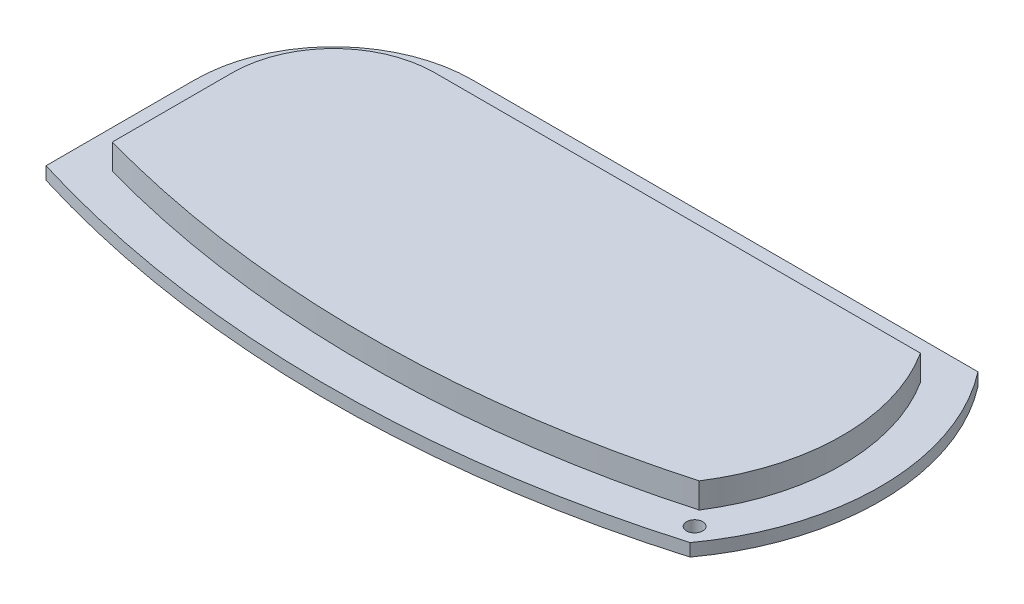
ISO-10303-21;
HEADER;
FILE_DESCRIPTION(('STEP AP214'),'2;1');
FILE_NAME('part.step','',(''),(''),'','','');
FILE_SCHEMA(('AUTOMOTIVE_DESIGN { 1 0 10303 214 1 1 1 1 }'));
ENDSEC;
DATA;
#1=APPLICATION_CONTEXT('core data for automotive mechanical design processes');
#2=APPLICATION_PROTOCOL_DEFINITION('international standard','automotive_design',2000,#1);
#3=PRODUCT_CONTEXT('',#1,'mechanical');
#4=PRODUCT('Part','Part','',(#3));
#5=PRODUCT_RELATED_PRODUCT_CATEGORY('part','',(#4));
#6=PRODUCT_DEFINITION_FORMATION('','',#4);
#7=PRODUCT_DEFINITION_CONTEXT('part definition',#1,'design');
#8=PRODUCT_DEFINITION('design','',#6,#7);
#9=PRODUCT_DEFINITION_SHAPE('','',#8);
#10=(LENGTH_UNIT() NAMED_UNIT(*) SI_UNIT(.MILLI.,.METRE.));
#11=(NAMED_UNIT(*) PLANE_ANGLE_UNIT() SI_UNIT($,.RADIAN.));
#12=(NAMED_UNIT(*) SI_UNIT($,.STERADIAN.) SOLID_ANGLE_UNIT());
#13=UNCERTAINTY_MEASURE_WITH_UNIT(LENGTH_MEASURE(1.E-05),#10,'distance_accuracy_value','');
#14=(GEOMETRIC_REPRESENTATION_CONTEXT(3) GLOBAL_UNCERTAINTY_ASSIGNED_CONTEXT((#13)) GLOBAL_UNIT_ASSIGNED_CONTEXT((#10,
#11,#12)) REPRESENTATION_CONTEXT('',''));
#15=CARTESIAN_POINT('',(0.,0.,0.));
#16=DIRECTION('',(0.,0.,1.));
#17=DIRECTION('',(1.,0.,0.));
#18=AXIS2_PLACEMENT_3D('',#15,#16,#17);
#19=CARTESIAN_POINT('',(30.2857594216587,-3.175,0.));
#20=DIRECTION('',(0.,1.,0.));
#21=DIRECTION('',(0.,0.,1.));
#22=AXIS2_PLACEMENT_3D('',#19,#20,#21);
#23=CYLINDRICAL_SURFACE('',#22,61.078020176966);
#24=CARTESIAN_POINT('',(30.2857594216587,0.,0.));
#25=DIRECTION('',(0.,1.,0.));
#26=DIRECTION('',(0.,0.,1.));
#27=AXIS2_PLACEMENT_3D('',#24,#25,#26);
#28=CIRCLE('',#27,61.078020176966);
#29=CARTESIAN_POINT('',(79.6261631448028,0.,36.0006820654139));
#30=VERTEX_POINT('',#29);
#31=CARTESIAN_POINT('',(78.6423878471117,0.,-37.311674259681));
#32=VERTEX_POINT('',#31);
#33=EDGE_CURVE('E161',#30,#32,#28,.T.);
#34=ORIENTED_EDGE('',*,*,#33,.F.);
#35=DIRECTION('',(0.,1.,0.));
#36=VECTOR('',#35,1.);
#37=CARTESIAN_POINT('',(79.6261631448028,-3.175,36.0006820654139));
#38=LINE('',#37,#36);
#39=CARTESIAN_POINT('',(79.6261631448028,-3.175,36.0006820654139));
#40=VERTEX_POINT('',#39);
#41=EDGE_CURVE('E12',#40,#30,#38,.T.);
#42=ORIENTED_EDGE('',*,*,#41,.F.);
#43=CARTESIAN_POINT('',(30.2857594216587,-3.175,0.));
#44=DIRECTION('',(0.,1.,0.));
#45=DIRECTION('',(0.,0.,1.));
#46=AXIS2_PLACEMENT_3D('',#43,#44,#45);
#47=CIRCLE('',#46,61.078020176966);
#48=CARTESIAN_POINT('',(78.6423878471117,-3.175,-37.311674259681));
#49=VERTEX_POINT('',#48);
#50=EDGE_CURVE('E167',#40,#49,#47,.T.);
#51=ORIENTED_EDGE('',*,*,#50,.T.);
#52=DIRECTION('',(0.,1.,0.));
#53=VECTOR('',#52,1.);
#54=CARTESIAN_POINT('',(78.6423878471117,-3.175,-37.311674259681));
#55=LINE('',#54,#53);
#56=EDGE_CURVE('E44',#49,#32,#55,.T.);
#57=ORIENTED_EDGE('',*,*,#56,.T.);
#58=EDGE_LOOP('',(#34,#42,#51,#57));
#59=FACE_BOUND('',#58,.T.);
#60=ADVANCED_FACE('F41',(#59),#23,.T.);
#61=CARTESIAN_POINT('',(0.,-3.175,-235.92277138056));
#62=DIRECTION('',(0.,1.,0.));
#63=DIRECTION('',(0.,0.,1.));
#64=AXIS2_PLACEMENT_3D('',#61,#62,#63);
#65=CYLINDRICAL_SURFACE('',#64,283.342002518419);
#66=CARTESIAN_POINT('',(0.,0.,-235.92277138056));
#67=DIRECTION('',(0.,1.,0.));
#68=DIRECTION('',(0.,0.,1.));
#69=AXIS2_PLACEMENT_3D('',#66,#67,#68);
#70=CIRCLE('',#69,283.342002518419);
#71=CARTESIAN_POINT('',(-83.2344237413939,0.,34.917995668246));
#72=VERTEX_POINT('',#71);
#73=EDGE_CURVE('E171',#72,#30,#70,.T.);
#74=ORIENTED_EDGE('',*,*,#73,.F.);
#75=DIRECTION('',(0.,1.,0.));
#76=VECTOR('',#75,1.);
#77=CARTESIAN_POINT('',(-83.2344237413939,-3.175,34.917995668246));
#78=LINE('',#77,#76);
#79=CARTESIAN_POINT('',(-83.2344237413939,-3.175,34.917995668246));
#80=VERTEX_POINT('',#79);
#81=EDGE_CURVE('E49',#80,#72,#78,.T.);
#82=ORIENTED_EDGE('',*,*,#81,.F.);
#83=CARTESIAN_POINT('',(0.,-3.175,-235.92277138056));
#84=DIRECTION('',(0.,1.,0.));
#85=DIRECTION('',(0.,0.,1.));
#86=AXIS2_PLACEMENT_3D('',#83,#84,#85);
#87=CIRCLE('',#86,283.342002518419);
#88=EDGE_CURVE('E180',#80,#40,#87,.T.);
#89=ORIENTED_EDGE('',*,*,#88,.T.);
#90=ORIENTED_EDGE('',*,*,#41,.T.);
#91=EDGE_LOOP('',(#74,#82,#89,#90));
#92=FACE_BOUND('',#91,.T.);
#93=ADVANCED_FACE('F212',(#92),#65,.T.);
#94=CARTESIAN_POINT('',(-83.2344237413939,-3.175,-2.38667425968075));
#95=DIRECTION('',(-1.,0.,0.));
#96=DIRECTION('',(0.,0.,1.));
#97=AXIS2_PLACEMENT_3D('',#94,#95,#96);
#98=PLANE('',#97);
#99=DIRECTION('',(0.,0.,1.));
#100=VECTOR('',#99,1.);
#101=CARTESIAN_POINT('',(-83.2344237413939,0.,-2.38667425968075));
#102=LINE('',#101,#100);
#103=CARTESIAN_POINT('',(-83.2344237413939,0.,-2.38667425968075));
#104=VERTEX_POINT('',#103);
#105=EDGE_CURVE('E191',#104,#72,#102,.T.);
#106=ORIENTED_EDGE('',*,*,#105,.F.);
#107=DIRECTION('',(0.,1.,0.));
#108=VECTOR('',#107,1.);
#109=CARTESIAN_POINT('',(-83.2344237413939,-3.175,-2.38667425968075));
#110=LINE('',#109,#108);
#111=CARTESIAN_POINT('',(-83.2344237413939,-3.175,-2.38667425968075));
#112=VERTEX_POINT('',#111);
#113=EDGE_CURVE('E197',#112,#104,#110,.T.);
#114=ORIENTED_EDGE('',*,*,#113,.F.);
#115=DIRECTION('',(0.,0.,1.));
#116=VECTOR('',#115,1.);
#117=CARTESIAN_POINT('',(-83.2344237413939,-3.175,-2.38667425968075));
#118=LINE('',#117,#116);
#119=EDGE_CURVE('E177',#112,#80,#118,.T.);
#120=ORIENTED_EDGE('',*,*,#119,.T.);
#121=ORIENTED_EDGE('',*,*,#81,.T.);
#122=EDGE_LOOP('',(#106,#114,#120,#121));
#123=FACE_BOUND('',#122,.T.);
#124=ADVANCED_FACE('F219',(#123),#98,.T.);
#125=CARTESIAN_POINT('',(-48.3094237413939,-3.175,-2.38667425968098));
#126=DIRECTION('',(0.,1.,0.));
#127=DIRECTION('',(0.,0.,1.));
#128=AXIS2_PLACEMENT_3D('',#125,#126,#127);
#129=CYLINDRICAL_SURFACE('',#128,34.925);
#130=CARTESIAN_POINT('',(-48.3094237413939,0.,-2.38667425968098));
#131=DIRECTION('',(0.,1.,0.));
#132=DIRECTION('',(0.,0.,1.));
#133=AXIS2_PLACEMENT_3D('',#130,#131,#132);
#134=CIRCLE('',#133,34.925);
#135=CARTESIAN_POINT('',(-48.3094237413937,0.,-37.311674259681));
#136=VERTEX_POINT('',#135);
#137=EDGE_CURVE('E188',#136,#104,#134,.T.);
#138=ORIENTED_EDGE('',*,*,#137,.F.);
#139=DIRECTION('',(0.,1.,0.));
#140=VECTOR('',#139,1.);
#141=CARTESIAN_POINT('',(-48.3094237413937,-3.175,-37.311674259681));
#142=LINE('',#141,#140);
#143=CARTESIAN_POINT('',(-48.3094237413937,-3.175,-37.311674259681));
#144=VERTEX_POINT('',#143);
#145=EDGE_CURVE('E198',#144,#136,#142,.T.);
#146=ORIENTED_EDGE('',*,*,#145,.F.);
#147=CARTESIAN_POINT('',(-48.3094237413939,-3.175,-2.38667425968098));
#148=DIRECTION('',(0.,1.,0.));
#149=DIRECTION('',(0.,0.,1.));
#150=AXIS2_PLACEMENT_3D('',#147,#148,#149);
#151=CIRCLE('',#150,34.925);
#152=EDGE_CURVE('E174',#144,#112,#151,.T.);
#153=ORIENTED_EDGE('',*,*,#152,.T.);
#154=ORIENTED_EDGE('',*,*,#113,.T.);
#155=EDGE_LOOP('',(#138,#146,#153,#154));
#156=FACE_BOUND('',#155,.T.);
#157=ADVANCED_FACE('F217',(#156),#129,.T.);
#158=CARTESIAN_POINT('',(78.6423878471117,-3.175,-37.311674259681));
#159=DIRECTION('',(0.,0.,-1.));
#160=DIRECTION('',(-1.,0.,0.));
#161=AXIS2_PLACEMENT_3D('',#158,#159,#160);
#162=PLANE('',#161);
#163=DIRECTION('',(-1.,0.,0.));
#164=VECTOR('',#163,1.);
#165=CARTESIAN_POINT('',(78.6423878471117,0.,-37.311674259681));
#166=LINE('',#165,#164);
#167=EDGE_CURVE('E185',#32,#136,#166,.T.);
#168=ORIENTED_EDGE('',*,*,#167,.F.);
#169=ORIENTED_EDGE('',*,*,#56,.F.);
#170=DIRECTION('',(-1.,0.,0.));
#171=VECTOR('',#170,1.);
#172=CARTESIAN_POINT('',(78.6423878471117,-3.175,-37.311674259681));
#173=LINE('',#172,#171);
#174=EDGE_CURVE('E170',#49,#144,#173,.T.);
#175=ORIENTED_EDGE('',*,*,#174,.T.);
#176=ORIENTED_EDGE('',*,*,#145,.T.);
#177=EDGE_LOOP('',(#168,#169,#175,#176));
#178=FACE_BOUND('',#177,.T.);
#179=ADVANCED_FACE('F206',(#178),#162,.T.);
#180=CARTESIAN_POINT('',(30.2857594216587,-3.175,0.));
#181=DIRECTION('',(0.,1.,0.));
#182=DIRECTION('',(0.,0.,1.));
#183=AXIS2_PLACEMENT_3D('',#180,#181,#182);
#184=PLANE('',#183);
#185=CARTESIAN_POINT('',(76.6677934430984,-3.175,31.8936781625475));
#186=DIRECTION('',(0.,1.,0.));
#187=DIRECTION('',(0.,0.,1.));
#188=AXIS2_PLACEMENT_3D('',#185,#186,#187);
#189=CIRCLE('',#188,2.03171353831895);
#190=CARTESIAN_POINT('',(76.6677934430984,-3.175,33.9253917008664));
#191=VERTEX_POINT('',#190);
#192=EDGE_CURVE('E152',#191,#191,#189,.T.);
#193=ORIENTED_EDGE('',*,*,#192,.T.);
#194=EDGE_LOOP('',(#193));
#195=FACE_BOUND('',#194,.T.);
#196=DIRECTION('',(-1.,0.,0.));
#197=VECTOR('',#196,1.);
#198=CARTESIAN_POINT('',(73.709423741394,-3.175,-27.786674259681));
#199=LINE('',#198,#197);
#200=CARTESIAN_POINT('',(73.709423741394,-3.175,-27.786674259681));
#201=VERTEX_POINT('',#200);
#202=CARTESIAN_POINT('',(-48.3094237413937,-3.175,-27.786674259681));
#203=VERTEX_POINT('',#202);
#204=EDGE_CURVE('E126',#201,#203,#199,.T.);
#205=ORIENTED_EDGE('',*,*,#204,.T.);
#206=CARTESIAN_POINT('',(-48.3094237413939,-3.175,-2.38667425968098));
#207=DIRECTION('',(0.,1.,0.));
#208=DIRECTION('',(0.,0.,1.));
#209=AXIS2_PLACEMENT_3D('',#206,#207,#208);
#210=CIRCLE('',#209,25.4);
#211=CARTESIAN_POINT('',(-73.7094237413939,-3.175,-2.3866742596808));
#212=VERTEX_POINT('',#211);
#213=EDGE_CURVE('E120',#203,#212,#210,.T.);
#214=ORIENTED_EDGE('',*,*,#213,.T.);
#215=DIRECTION('',(0.,0.,1.));
#216=VECTOR('',#215,1.);
#217=CARTESIAN_POINT('',(-73.7094237413939,-3.175,-2.3866742596808));
#218=LINE('',#217,#216);
#219=CARTESIAN_POINT('',(-73.709423741394,-3.175,27.786674259681));
#220=VERTEX_POINT('',#219);
#221=EDGE_CURVE('E129',#212,#220,#218,.T.);
#222=ORIENTED_EDGE('',*,*,#221,.T.);
#223=CARTESIAN_POINT('',(0.,-3.175,-235.92277138056));
#224=DIRECTION('',(0.,1.,0.));
#225=DIRECTION('',(0.,0.,1.));
#226=AXIS2_PLACEMENT_3D('',#223,#224,#225);
#227=CIRCLE('',#226,273.817002518419);
#228=CARTESIAN_POINT('',(73.709423741394,-3.175,27.786674259681));
#229=VERTEX_POINT('',#228);
#230=EDGE_CURVE('E57',#220,#229,#227,.T.);
#231=ORIENTED_EDGE('',*,*,#230,.T.);
#232=CARTESIAN_POINT('',(30.2857594216587,-3.175,0.));
#233=DIRECTION('',(0.,1.,0.));
#234=DIRECTION('',(0.,0.,1.));
#235=AXIS2_PLACEMENT_3D('',#232,#233,#234);
#236=CIRCLE('',#235,51.5530201769661);
#237=EDGE_CURVE('E147',#229,#201,#236,.T.);
#238=ORIENTED_EDGE('',*,*,#237,.T.);
#239=EDGE_LOOP('',(#205,#214,#222,#231,#238));
#240=FACE_BOUND('',#239,.T.);
#241=ORIENTED_EDGE('',*,*,#50,.F.);
#242=ORIENTED_EDGE('',*,*,#88,.F.);
#243=ORIENTED_EDGE('',*,*,#119,.F.);
#244=ORIENTED_EDGE('',*,*,#152,.F.);
#245=ORIENTED_EDGE('',*,*,#174,.F.);
#246=EDGE_LOOP('',(#241,#242,#243,#244,#245));
#247=FACE_BOUND('',#246,.T.);
#248=ADVANCED_FACE('F133',(#195,#240,#247),#184,.F.);
#249=CARTESIAN_POINT('',(30.2857594216587,0.,0.));
#250=DIRECTION('',(0.,1.,0.));
#251=DIRECTION('',(0.,0.,1.));
#252=AXIS2_PLACEMENT_3D('',#249,#250,#251);
#253=PLANE('',#252);
#254=CARTESIAN_POINT('',(76.6677934430984,0.,31.8936781625475));
#255=DIRECTION('',(0.,1.,0.));
#256=DIRECTION('',(0.,0.,1.));
#257=AXIS2_PLACEMENT_3D('',#254,#255,#256);
#258=CIRCLE('',#257,2.03171353831895);
#259=CARTESIAN_POINT('',(76.6677934430984,0.,33.9253917008664));
#260=VERTEX_POINT('',#259);
#261=EDGE_CURVE('E143',#260,#260,#258,.T.);
#262=ORIENTED_EDGE('',*,*,#261,.F.);
#263=EDGE_LOOP('',(#262));
#264=FACE_BOUND('',#263,.T.);
#265=CARTESIAN_POINT('',(-48.3094237413939,0.,-2.38667425968098));
#266=DIRECTION('',(0.,1.,0.));
#267=DIRECTION('',(0.,0.,1.));
#268=AXIS2_PLACEMENT_3D('',#265,#266,#267);
#269=CIRCLE('',#268,25.4);
#270=CARTESIAN_POINT('',(-48.3094237413937,0.,-27.786674259681));
#271=VERTEX_POINT('',#270);
#272=CARTESIAN_POINT('',(-73.7094237413939,0.,-2.3866742596808));
#273=VERTEX_POINT('',#272);
#274=EDGE_CURVE('E65',#271,#273,#269,.T.);
#275=ORIENTED_EDGE('',*,*,#274,.F.);
#276=DIRECTION('',(-1.,0.,0.));
#277=VECTOR('',#276,1.);
#278=CARTESIAN_POINT('',(73.709423741394,0.,-27.786674259681));
#279=LINE('',#278,#277);
#280=CARTESIAN_POINT('',(73.709423741394,0.,-27.786674259681));
#281=VERTEX_POINT('',#280);
#282=EDGE_CURVE('E137',#281,#271,#279,.T.);
#283=ORIENTED_EDGE('',*,*,#282,.F.);
#284=CARTESIAN_POINT('',(30.2857594216587,0.,0.));
#285=DIRECTION('',(0.,1.,0.));
#286=DIRECTION('',(0.,0.,1.));
#287=AXIS2_PLACEMENT_3D('',#284,#285,#286);
#288=CIRCLE('',#287,51.5530201769661);
#289=CARTESIAN_POINT('',(73.709423741394,0.,27.786674259681));
#290=VERTEX_POINT('',#289);
#291=EDGE_CURVE('E140',#290,#281,#288,.T.);
#292=ORIENTED_EDGE('',*,*,#291,.F.);
#293=CARTESIAN_POINT('',(0.,0.,-235.92277138056));
#294=DIRECTION('',(0.,1.,0.));
#295=DIRECTION('',(0.,0.,1.));
#296=AXIS2_PLACEMENT_3D('',#293,#294,#295);
#297=CIRCLE('',#296,273.817002518419);
#298=CARTESIAN_POINT('',(-73.709423741394,0.,27.786674259681));
#299=VERTEX_POINT('',#298);
#300=EDGE_CURVE('E154',#299,#290,#297,.T.);
#301=ORIENTED_EDGE('',*,*,#300,.F.);
#302=DIRECTION('',(0.,0.,1.));
#303=VECTOR('',#302,1.);
#304=CARTESIAN_POINT('',(-73.7094237413939,0.,-2.3866742596808));
#305=LINE('',#304,#303);
#306=EDGE_CURVE('E151',#273,#299,#305,.T.);
#307=ORIENTED_EDGE('',*,*,#306,.F.);
#308=EDGE_LOOP('',(#275,#283,#292,#301,#307));
#309=FACE_BOUND('',#308,.T.);
#310=ORIENTED_EDGE('',*,*,#33,.T.);
#311=ORIENTED_EDGE('',*,*,#167,.T.);
#312=ORIENTED_EDGE('',*,*,#137,.T.);
#313=ORIENTED_EDGE('',*,*,#105,.T.);
#314=ORIENTED_EDGE('',*,*,#73,.T.);
#315=EDGE_LOOP('',(#310,#311,#312,#313,#314));
#316=FACE_BOUND('',#315,.T.);
#317=ADVANCED_FACE('F208',(#264,#309,#316),#253,.T.);
#318=CARTESIAN_POINT('',(-48.3094237413939,-3.175,-2.38667425968098));
#319=DIRECTION('',(0.,1.,0.));
#320=DIRECTION('',(0.,0.,1.));
#321=AXIS2_PLACEMENT_3D('',#318,#319,#320);
#322=CYLINDRICAL_SURFACE('',#321,25.4);
#323=ORIENTED_EDGE('',*,*,#274,.T.);
#324=DIRECTION('',(0.,1.,0.));
#325=VECTOR('',#324,1.);
#326=CARTESIAN_POINT('',(-73.7094237413939,-3.175,-2.3866742596808));
#327=LINE('',#326,#325);
#328=EDGE_CURVE('E116',#212,#273,#327,.T.);
#329=ORIENTED_EDGE('',*,*,#328,.F.);
#330=ORIENTED_EDGE('',*,*,#213,.F.);
#331=DIRECTION('',(0.,1.,0.));
#332=VECTOR('',#331,1.);
#333=CARTESIAN_POINT('',(-48.3094237413937,-3.175,-27.786674259681));
#334=LINE('',#333,#332);
#335=EDGE_CURVE('E159',#203,#271,#334,.T.);
#336=ORIENTED_EDGE('',*,*,#335,.T.);
#337=EDGE_LOOP('',(#323,#329,#330,#336));
#338=FACE_BOUND('',#337,.T.);
#339=ADVANCED_FACE('F118',(#338),#322,.F.);
#340=CARTESIAN_POINT('',(73.709423741394,-3.175,-27.786674259681));
#341=DIRECTION('',(0.,0.,-1.));
#342=DIRECTION('',(-1.,0.,0.));
#343=AXIS2_PLACEMENT_3D('',#340,#341,#342);
#344=PLANE('',#343);
#345=ORIENTED_EDGE('',*,*,#282,.T.);
#346=ORIENTED_EDGE('',*,*,#335,.F.);
#347=ORIENTED_EDGE('',*,*,#204,.F.);
#348=DIRECTION('',(0.,1.,0.));
#349=VECTOR('',#348,1.);
#350=CARTESIAN_POINT('',(73.709423741394,-3.175,-27.786674259681));
#351=LINE('',#350,#349);
#352=EDGE_CURVE('E162',#201,#281,#351,.T.);
#353=ORIENTED_EDGE('',*,*,#352,.T.);
#354=EDGE_LOOP('',(#345,#346,#347,#353));
#355=FACE_BOUND('',#354,.T.);
#356=ADVANCED_FACE('F263',(#355),#344,.F.);
#357=CARTESIAN_POINT('',(30.2857594216587,-3.175,0.));
#358=DIRECTION('',(0.,1.,0.));
#359=DIRECTION('',(0.,0.,1.));
#360=AXIS2_PLACEMENT_3D('',#357,#358,#359);
#361=CYLINDRICAL_SURFACE('',#360,51.5530201769661);
#362=ORIENTED_EDGE('',*,*,#291,.T.);
#363=ORIENTED_EDGE('',*,*,#352,.F.);
#364=ORIENTED_EDGE('',*,*,#237,.F.);
#365=DIRECTION('',(0.,1.,0.));
#366=VECTOR('',#365,1.);
#367=CARTESIAN_POINT('',(73.709423741394,-3.175,27.786674259681));
#368=LINE('',#367,#366);
#369=EDGE_CURVE('E164',#229,#290,#368,.T.);
#370=ORIENTED_EDGE('',*,*,#369,.T.);
#371=EDGE_LOOP('',(#362,#363,#364,#370));
#372=FACE_BOUND('',#371,.T.);
#373=ADVANCED_FACE('F274',(#372),#361,.F.);
#374=CARTESIAN_POINT('',(0.,-3.175,-235.92277138056));
#375=DIRECTION('',(0.,1.,0.));
#376=DIRECTION('',(0.,0.,1.));
#377=AXIS2_PLACEMENT_3D('',#374,#375,#376);
#378=CYLINDRICAL_SURFACE('',#377,273.817002518419);
#379=ORIENTED_EDGE('',*,*,#300,.T.);
#380=ORIENTED_EDGE('',*,*,#369,.F.);
#381=ORIENTED_EDGE('',*,*,#230,.F.);
#382=DIRECTION('',(0.,1.,0.));
#383=VECTOR('',#382,1.);
#384=CARTESIAN_POINT('',(-73.709423741394,-3.175,27.786674259681));
#385=LINE('',#384,#383);
#386=EDGE_CURVE('E125',#220,#299,#385,.T.);
#387=ORIENTED_EDGE('',*,*,#386,.T.);
#388=EDGE_LOOP('',(#379,#380,#381,#387));
#389=FACE_BOUND('',#388,.T.);
#390=ADVANCED_FACE('F284',(#389),#378,.F.);
#391=CARTESIAN_POINT('',(-73.7094237413939,-3.175,-2.3866742596808));
#392=DIRECTION('',(-1.,0.,0.));
#393=DIRECTION('',(0.,0.,1.));
#394=AXIS2_PLACEMENT_3D('',#391,#392,#393);
#395=PLANE('',#394);
#396=ORIENTED_EDGE('',*,*,#306,.T.);
#397=ORIENTED_EDGE('',*,*,#386,.F.);
#398=ORIENTED_EDGE('',*,*,#221,.F.);
#399=ORIENTED_EDGE('',*,*,#328,.T.);
#400=EDGE_LOOP('',(#396,#397,#398,#399));
#401=FACE_BOUND('',#400,.T.);
#402=ADVANCED_FACE('F130',(#401),#395,.F.);
#403=CARTESIAN_POINT('',(76.6677934430984,-3.175,31.8936781625475));
#404=DIRECTION('',(0.,1.,0.));
#405=DIRECTION('',(0.,0.,1.));
#406=AXIS2_PLACEMENT_3D('',#403,#404,#405);
#407=CYLINDRICAL_SURFACE('',#406,2.03171353831895);
#408=ORIENTED_EDGE('',*,*,#192,.F.);
#409=EDGE_LOOP('',(#408));
#410=FACE_BOUND('',#409,.T.);
#411=ORIENTED_EDGE('',*,*,#261,.T.);
#412=EDGE_LOOP('',(#411));
#413=FACE_BOUND('',#412,.T.);
#414=ADVANCED_FACE('F302',(#410,#413),#407,.F.);
#415=CLOSED_SHELL('',(#60,#93,#124,#157,#179,#248,#317,#339,#356,#373,#390,#402,#414));
#416=MANIFOLD_SOLID_BREP('B2',#415);
#417=CARTESIAN_POINT('',(0.,6.35,-235.92277138056));
#418=DIRECTION('',(0.,-1.,0.));
#419=DIRECTION('',(0.,0.,-1.));
#420=AXIS2_PLACEMENT_3D('',#417,#418,#419);
#421=CYLINDRICAL_SURFACE('',#420,273.817002518419);
#422=CARTESIAN_POINT('',(0.,0.,-235.92277138056));
#423=DIRECTION('',(0.,1.,0.));
#424=DIRECTION('',(0.,0.,1.));
#425=AXIS2_PLACEMENT_3D('',#422,#423,#424);
#426=CIRCLE('',#425,273.817002518419);
#427=CARTESIAN_POINT('',(-73.7094237413939,0.,27.786674259681));
#428=VERTEX_POINT('',#427);
#429=CARTESIAN_POINT('',(73.709423741394,0.,27.7866742596809));
#430=VERTEX_POINT('',#429);
#431=EDGE_CURVE('E418',#428,#430,#426,.T.);
#432=ORIENTED_EDGE('',*,*,#431,.T.);
#433=DIRECTION('',(0.,-1.,0.));
#434=VECTOR('',#433,1.);
#435=CARTESIAN_POINT('',(73.709423741394,6.35,27.7866742596809));
#436=LINE('',#435,#434);
#437=CARTESIAN_POINT('',(73.709423741394,6.35,27.7866742596809));
#438=VERTEX_POINT('',#437);
#439=EDGE_CURVE('E39',#438,#430,#436,.T.);
#440=ORIENTED_EDGE('',*,*,#439,.F.);
#441=CARTESIAN_POINT('',(0.,6.35,-235.92277138056));
#442=DIRECTION('',(0.,1.,0.));
#443=DIRECTION('',(0.,0.,1.));
#444=AXIS2_PLACEMENT_3D('',#441,#442,#443);
#445=CIRCLE('',#444,273.817002518419);
#446=CARTESIAN_POINT('',(-73.7094237413939,6.35,27.786674259681));
#447=VERTEX_POINT('',#446);
#448=EDGE_CURVE('E426',#447,#438,#445,.T.);
#449=ORIENTED_EDGE('',*,*,#448,.F.);
#450=DIRECTION('',(0.,-1.,0.));
#451=VECTOR('',#450,1.);
#452=CARTESIAN_POINT('',(-73.7094237413939,6.35,27.786674259681));
#453=LINE('',#452,#451);
#454=EDGE_CURVE('E414',#447,#428,#453,.T.);
#455=ORIENTED_EDGE('',*,*,#454,.T.);
#456=EDGE_LOOP('',(#432,#440,#449,#455));
#457=FACE_BOUND('',#456,.T.);
#458=ADVANCED_FACE('F344',(#457),#421,.T.);
#459=CARTESIAN_POINT('',(30.2857594216587,6.35,0.));
#460=DIRECTION('',(0.,-1.,0.));
#461=DIRECTION('',(0.,0.,-1.));
#462=AXIS2_PLACEMENT_3D('',#459,#460,#461);
#463=CYLINDRICAL_SURFACE('',#462,51.5530201769661);
#464=CARTESIAN_POINT('',(30.2857594216587,0.,0.));
#465=DIRECTION('',(0.,1.,0.));
#466=DIRECTION('',(0.,0.,-1.));
#467=AXIS2_PLACEMENT_3D('',#464,#465,#466);
#468=CIRCLE('',#467,51.5530201769661);
#469=CARTESIAN_POINT('',(73.709423741394,0.,-27.7866742596809));
#470=VERTEX_POINT('',#469);
#471=EDGE_CURVE('E421',#430,#470,#468,.T.);
#472=ORIENTED_EDGE('',*,*,#471,.T.);
#473=DIRECTION('',(0.,-1.,0.));
#474=VECTOR('',#473,1.);
#475=CARTESIAN_POINT('',(73.709423741394,6.35,-27.7866742596809));
#476=LINE('',#475,#474);
#477=CARTESIAN_POINT('',(73.709423741394,6.35,-27.7866742596809));
#478=VERTEX_POINT('',#477);
#479=EDGE_CURVE('E352',#478,#470,#476,.T.);
#480=ORIENTED_EDGE('',*,*,#479,.F.);
#481=CARTESIAN_POINT('',(30.2857594216587,6.35,0.));
#482=DIRECTION('',(0.,1.,0.));
#483=DIRECTION('',(0.,0.,-1.));
#484=AXIS2_PLACEMENT_3D('',#481,#482,#483);
#485=CIRCLE('',#484,51.5530201769661);
#486=EDGE_CURVE('E394',#438,#478,#485,.T.);
#487=ORIENTED_EDGE('',*,*,#486,.F.);
#488=ORIENTED_EDGE('',*,*,#439,.T.);
#489=EDGE_LOOP('',(#472,#480,#487,#488));
#490=FACE_BOUND('',#489,.T.);
#491=ADVANCED_FACE('F445',(#490),#463,.T.);
#492=CARTESIAN_POINT('',(73.709423741394,6.35,-27.7866742596809));
#493=DIRECTION('',(0.,0.,1.));
#494=DIRECTION('',(1.,0.,0.));
#495=AXIS2_PLACEMENT_3D('',#492,#493,#494);
#496=PLANE('',#495);
#497=DIRECTION('',(-1.,0.,0.));
#498=VECTOR('',#497,1.);
#499=CARTESIAN_POINT('',(73.709423741394,0.,-27.7866742596809));
#500=LINE('',#499,#498);
#501=CARTESIAN_POINT('',(-48.3094237413937,0.,-27.786674259681));
#502=VERTEX_POINT('',#501);
#503=EDGE_CURVE('E409',#470,#502,#500,.T.);
#504=ORIENTED_EDGE('',*,*,#503,.T.);
#505=DIRECTION('',(0.,-1.,0.));
#506=VECTOR('',#505,1.);
#507=CARTESIAN_POINT('',(-48.3094237413937,6.35,-27.786674259681));
#508=LINE('',#507,#506);
#509=CARTESIAN_POINT('',(-48.3094237413937,6.35,-27.786674259681));
#510=VERTEX_POINT('',#509);
#511=EDGE_CURVE('E406',#510,#502,#508,.T.);
#512=ORIENTED_EDGE('',*,*,#511,.F.);
#513=DIRECTION('',(-1.,0.,0.));
#514=VECTOR('',#513,1.);
#515=CARTESIAN_POINT('',(73.709423741394,6.35,-27.7866742596809));
#516=LINE('',#515,#514);
#517=EDGE_CURVE('E398',#478,#510,#516,.T.);
#518=ORIENTED_EDGE('',*,*,#517,.F.);
#519=ORIENTED_EDGE('',*,*,#479,.T.);
#520=EDGE_LOOP('',(#504,#512,#518,#519));
#521=FACE_BOUND('',#520,.T.);
#522=ADVANCED_FACE('F407',(#521),#496,.F.);
#523=CARTESIAN_POINT('',(-48.3094237413939,6.35,-2.38667425968098));
#524=DIRECTION('',(0.,-1.,0.));
#525=DIRECTION('',(0.,0.,-1.));
#526=AXIS2_PLACEMENT_3D('',#523,#524,#525);
#527=CYLINDRICAL_SURFACE('',#526,25.4);
#528=CARTESIAN_POINT('',(-48.3094237413939,0.,-2.38667425968098));
#529=DIRECTION('',(0.,1.,0.));
#530=DIRECTION('',(0.,0.,1.));
#531=AXIS2_PLACEMENT_3D('',#528,#529,#530);
#532=CIRCLE('',#531,25.4);
#533=CARTESIAN_POINT('',(-73.7094237413939,0.,-2.3866742596808));
#534=VERTEX_POINT('',#533);
#535=EDGE_CURVE('E380',#502,#534,#532,.T.);
#536=ORIENTED_EDGE('',*,*,#535,.T.);
#537=DIRECTION('',(0.,-1.,0.));
#538=VECTOR('',#537,1.);
#539=CARTESIAN_POINT('',(-73.7094237413939,6.35,-2.3866742596808));
#540=LINE('',#539,#538);
#541=CARTESIAN_POINT('',(-73.7094237413939,6.35,-2.3866742596808));
#542=VERTEX_POINT('',#541);
#543=EDGE_CURVE('E410',#542,#534,#540,.T.);
#544=ORIENTED_EDGE('',*,*,#543,.F.);
#545=CARTESIAN_POINT('',(-48.3094237413939,6.35,-2.38667425968098));
#546=DIRECTION('',(0.,1.,0.));
#547=DIRECTION('',(0.,0.,1.));
#548=AXIS2_PLACEMENT_3D('',#545,#546,#547);
#549=CIRCLE('',#548,25.4);
#550=EDGE_CURVE('E402',#510,#542,#549,.T.);
#551=ORIENTED_EDGE('',*,*,#550,.F.);
#552=ORIENTED_EDGE('',*,*,#511,.T.);
#553=EDGE_LOOP('',(#536,#544,#551,#552));
#554=FACE_BOUND('',#553,.T.);
#555=ADVANCED_FACE('F412',(#554),#527,.T.);
#556=CARTESIAN_POINT('',(-73.7094237413939,6.35,-2.3866742596808));
#557=DIRECTION('',(1.,0.,0.));
#558=DIRECTION('',(0.,0.,-1.));
#559=AXIS2_PLACEMENT_3D('',#556,#557,#558);
#560=PLANE('',#559);
#561=DIRECTION('',(0.,0.,1.));
#562=VECTOR('',#561,1.);
#563=CARTESIAN_POINT('',(-73.7094237413939,0.,-2.3866742596808));
#564=LINE('',#563,#562);
#565=EDGE_CURVE('E386',#534,#428,#564,.T.);
#566=ORIENTED_EDGE('',*,*,#565,.T.);
#567=ORIENTED_EDGE('',*,*,#454,.F.);
#568=DIRECTION('',(0.,0.,1.));
#569=VECTOR('',#568,1.);
#570=CARTESIAN_POINT('',(-73.7094237413939,6.35,-2.3866742596808));
#571=LINE('',#570,#569);
#572=EDGE_CURVE('E360',#542,#447,#571,.T.);
#573=ORIENTED_EDGE('',*,*,#572,.F.);
#574=ORIENTED_EDGE('',*,*,#543,.T.);
#575=EDGE_LOOP('',(#566,#567,#573,#574));
#576=FACE_BOUND('',#575,.T.);
#577=ADVANCED_FACE('F434',(#576),#560,.F.);
#578=CARTESIAN_POINT('',(0.,6.35,-235.92277138056));
#579=DIRECTION('',(0.,1.,0.));
#580=DIRECTION('',(0.,0.,1.));
#581=AXIS2_PLACEMENT_3D('',#578,#579,#580);
#582=PLANE('',#581);
#583=ORIENTED_EDGE('',*,*,#448,.T.);
#584=ORIENTED_EDGE('',*,*,#486,.T.);
#585=ORIENTED_EDGE('',*,*,#517,.T.);
#586=ORIENTED_EDGE('',*,*,#550,.T.);
#587=ORIENTED_EDGE('',*,*,#572,.T.);
#588=EDGE_LOOP('',(#583,#584,#585,#586,#587));
#589=FACE_BOUND('',#588,.T.);
#590=ADVANCED_FACE('F400',(#589),#582,.T.);
#591=CARTESIAN_POINT('',(0.,0.,-235.92277138056));
#592=DIRECTION('',(0.,1.,0.));
#593=DIRECTION('',(0.,0.,1.));
#594=AXIS2_PLACEMENT_3D('',#591,#592,#593);
#595=PLANE('',#594);
#596=ORIENTED_EDGE('',*,*,#431,.F.);
#597=ORIENTED_EDGE('',*,*,#565,.F.);
#598=ORIENTED_EDGE('',*,*,#535,.F.);
#599=ORIENTED_EDGE('',*,*,#503,.F.);
#600=ORIENTED_EDGE('',*,*,#471,.F.);
#601=EDGE_LOOP('',(#596,#597,#598,#599,#600));
#602=FACE_BOUND('',#601,.T.);
#603=ADVANCED_FACE('F430',(#602),#595,.F.);
#604=CLOSED_SHELL('',(#458,#491,#522,#555,#577,#590,#603));
#605=MANIFOLD_SOLID_BREP('B6',#604);
#606=ADVANCED_BREP_SHAPE_REPRESENTATION('',(#18,#416,#605),#14);
#607=SHAPE_DEFINITION_REPRESENTATION(#9,#606);
ENDSEC;
END-ISO-10303-21;
